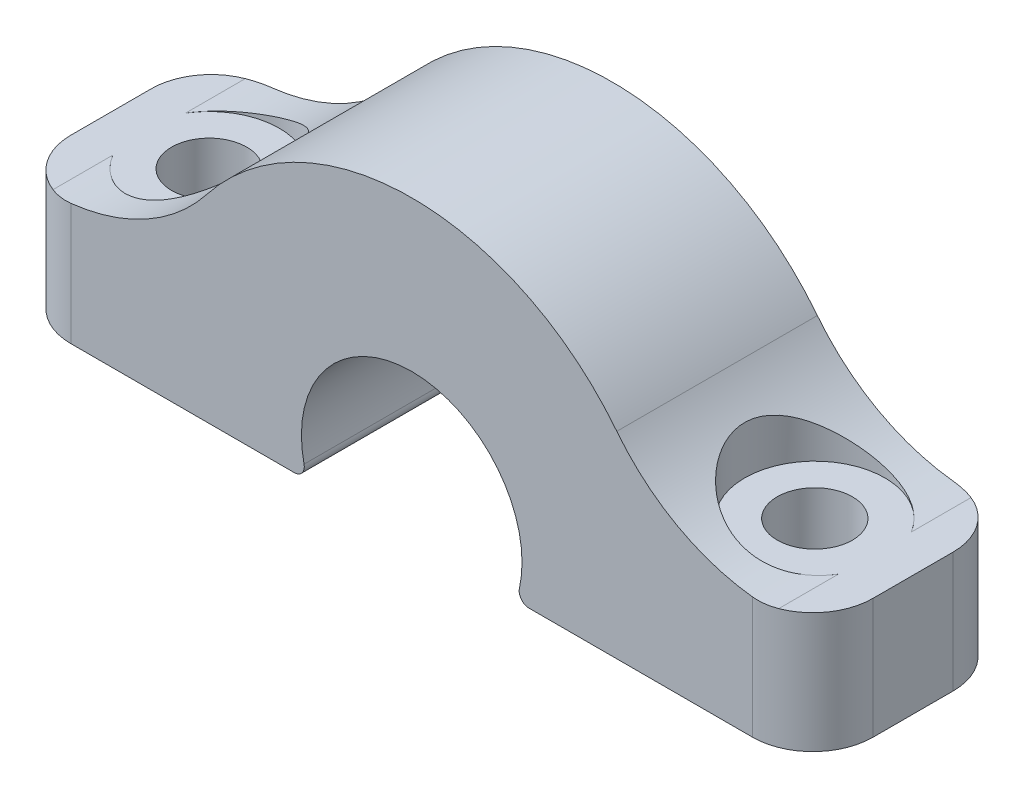
ISO-10303-21;
HEADER;
FILE_DESCRIPTION(('STEP AP214'),'2;1');
FILE_NAME('part.step','',(''),(''),'','','');
FILE_SCHEMA(('AUTOMOTIVE_DESIGN { 1 0 10303 214 1 1 1 1 }'));
ENDSEC;
DATA;
#1=APPLICATION_CONTEXT('core data for automotive mechanical design processes');
#2=APPLICATION_PROTOCOL_DEFINITION('international standard','automotive_design',2000,#1);
#3=PRODUCT_CONTEXT('',#1,'mechanical');
#4=PRODUCT('Part','Part','',(#3));
#5=PRODUCT_RELATED_PRODUCT_CATEGORY('part','',(#4));
#6=PRODUCT_DEFINITION_FORMATION('','',#4);
#7=PRODUCT_DEFINITION_CONTEXT('part definition',#1,'design');
#8=PRODUCT_DEFINITION('design','',#6,#7);
#9=PRODUCT_DEFINITION_SHAPE('','',#8);
#10=(LENGTH_UNIT() NAMED_UNIT(*) SI_UNIT(.MILLI.,.METRE.));
#11=(NAMED_UNIT(*) PLANE_ANGLE_UNIT() SI_UNIT($,.RADIAN.));
#12=(NAMED_UNIT(*) SI_UNIT($,.STERADIAN.) SOLID_ANGLE_UNIT());
#13=UNCERTAINTY_MEASURE_WITH_UNIT(LENGTH_MEASURE(1.E-05),#10,'distance_accuracy_value','');
#14=(GEOMETRIC_REPRESENTATION_CONTEXT(3) GLOBAL_UNCERTAINTY_ASSIGNED_CONTEXT((#13)) GLOBAL_UNIT_ASSIGNED_CONTEXT((#10,
#11,#12)) REPRESENTATION_CONTEXT('',''));
#15=CARTESIAN_POINT('',(0.,0.,0.));
#16=DIRECTION('',(0.,0.,1.));
#17=DIRECTION('',(1.,0.,0.));
#18=AXIS2_PLACEMENT_3D('',#15,#16,#17);
#19=CARTESIAN_POINT('',(18.0930926046378,17.,-5.));
#20=DIRECTION('',(0.,0.,1.));
#21=DIRECTION('',(1.,0.,0.));
#22=AXIS2_PLACEMENT_3D('',#19,#20,#21);
#23=CYLINDRICAL_SURFACE('',#22,10.);
#24=CARTESIAN_POINT('',(15.1,7.45843845798486,-3.5));
#25=CARTESIAN_POINT('',(14.9957744815553,7.49113363654862,-3.49999937894351));
#26=CARTESIAN_POINT('',(14.8920503182847,7.52555320507264,-3.49533712732048));
#27=CARTESIAN_POINT('',(14.6864704692407,7.59750925332968,-3.4770199790426));
#28=CARTESIAN_POINT('',(14.5846161602821,7.63504792553514,-3.46335870928451));
#29=CARTESIAN_POINT('',(14.2824899176906,7.75198358004934,-3.40932965524012));
#30=CARTESIAN_POINT('',(14.0860212484733,7.83558448011288,-3.35591892824392));
#31=CARTESIAN_POINT('',(13.7093247893162,8.00969664178313,-3.21809350096264));
#32=CARTESIAN_POINT('',(13.529012882222,8.10016695792562,-3.13385258982976));
#33=CARTESIAN_POINT('',(13.1863493665392,8.28439911478833,-2.93716871963753));
#34=CARTESIAN_POINT('',(13.02400023678,8.37816140744907,-2.82472187519056));
#35=CARTESIAN_POINT('',(12.7065629849136,8.57249224575692,-2.56271175755584));
#36=CARTESIAN_POINT('',(12.5533637698057,8.67293561779904,-2.41075656121847));
#37=CARTESIAN_POINT('',(12.2752726352632,8.86480192370938,-2.07794628512325));
#38=CARTESIAN_POINT('',(12.1503521796092,8.95623389792142,-1.89712065580072));
#39=CARTESIAN_POINT('',(11.9626391695541,9.09888545795057,-1.56001922457868));
#40=CARTESIAN_POINT('',(11.8921514642007,9.15434833718121,-1.40986803018752));
#41=CARTESIAN_POINT('',(11.802185773267,9.22658581403245,-1.17534780702147));
#42=CARTESIAN_POINT('',(11.7748256169936,9.24883817568156,-1.09562879811018));
#43=CARTESIAN_POINT('',(11.7257125784066,9.28913220849675,-0.933462509857196));
#44=CARTESIAN_POINT('',(11.7039571578905,9.30717578533317,-0.851016484648285));
#45=CARTESIAN_POINT('',(11.6662221241169,9.33867193699765,-0.683111797568064));
#46=CARTESIAN_POINT('',(11.6502980817797,9.35208027541501,-0.597632255087932));
#47=CARTESIAN_POINT('',(11.6248193687653,9.37361681617258,-0.42510997969888));
#48=CARTESIAN_POINT('',(11.6152614657036,9.38174769806889,-0.338068063171454));
#49=CARTESIAN_POINT('',(11.6027085577498,9.3924388625069,-0.163187769991199));
#50=CARTESIAN_POINT('',(11.5997116662892,9.39500074636982,-0.0753496295830434));
#51=CARTESIAN_POINT('',(11.6003326450853,9.39447182720633,0.100256545071428));
#52=CARTESIAN_POINT('',(11.6039498388818,9.39138160225339,0.188024585568789));
#53=CARTESIAN_POINT('',(11.6228314718648,9.37530143219923,0.427055087597409));
#54=CARTESIAN_POINT('',(11.6447101447259,9.35669817190197,0.57749253583343));
#55=CARTESIAN_POINT('',(11.7069447325321,9.30463072760712,0.871703498224611));
#56=CARTESIAN_POINT('',(11.7473083321797,9.27116036311155,1.01547421342967));
#57=CARTESIAN_POINT('',(11.8469541618087,9.19038766563389,1.30061826486027));
#58=CARTESIAN_POINT('',(11.9070679776435,9.14248688068783,1.44152729686208));
#59=CARTESIAN_POINT('',(12.0432555740981,9.03715631246864,1.71149416262173));
#60=CARTESIAN_POINT('',(12.1193362467417,8.97972241651586,1.84054684393924));
#61=CARTESIAN_POINT('',(12.3032809386475,8.84563905955013,2.11202692115639));
#62=CARTESIAN_POINT('',(12.4144634126502,8.76749968202169,2.25146977371429));
#63=CARTESIAN_POINT('',(12.6550416510483,8.60663424610772,2.51067488688945));
#64=CARTESIAN_POINT('',(12.7844535922079,8.52390415389179,2.63041946047944));
#65=CARTESIAN_POINT('',(13.085600845355,8.3419672382751,2.86982458403003));
#66=CARTESIAN_POINT('',(13.2607076911718,8.24261230718238,2.98515884804211));
#67=CARTESIAN_POINT('',(13.6308432677508,8.04835682973504,3.18364694361469));
#68=CARTESIAN_POINT('',(13.8258789010724,7.95345784347094,3.26678957716333));
#69=CARTESIAN_POINT('',(14.1323788401958,7.81709485270784,3.3653554471492));
#70=CARTESIAN_POINT('',(14.2381901877526,7.77215023832249,3.3940271875056));
#71=CARTESIAN_POINT('',(14.4531899577727,7.68525293462506,3.44147324397777));
#72=CARTESIAN_POINT('',(14.5623767863815,7.64329886324644,3.46025215800144));
#73=CARTESIAN_POINT('',(14.7832483134498,7.56290595365833,3.48741245178604));
#74=CARTESIAN_POINT('',(14.8949317308244,7.52446536185573,3.49579904493841));
#75=CARTESIAN_POINT('',(15.1198568836275,7.45150078429819,3.50175029356037));
#76=CARTESIAN_POINT('',(15.2330983884136,7.41697622570415,3.49931653393513));
#77=CARTESIAN_POINT('',(15.4478609074293,7.35563068656795,3.48415147405378));
#78=CARTESIAN_POINT('',(15.5493401578691,7.32838071121656,3.47254931625256));
#79=CARTESIAN_POINT('',(15.7517426466029,7.27739915762988,3.440309474335));
#80=CARTESIAN_POINT('',(15.8526659469785,7.25366717855236,3.41967282067446));
#81=CARTESIAN_POINT('',(16.0529765019127,7.20977852684445,3.36934653787664));
#82=CARTESIAN_POINT('',(16.152364383771,7.18962035686131,3.33966071440072));
#83=CARTESIAN_POINT('',(16.3486793023969,7.15281794401081,3.27132997948347));
#84=CARTESIAN_POINT('',(16.4456064874189,7.13617348900141,3.23268560921394));
#85=CARTESIAN_POINT('',(16.6274283587798,7.10760294226065,3.15055490896479));
#86=CARTESIAN_POINT('',(16.712618779908,7.09538636320077,3.10782188171888));
#87=CARTESIAN_POINT('',(16.8795081963375,7.07355562454869,3.01536965362439));
#88=CARTESIAN_POINT('',(16.9612059868913,7.06394235693911,2.96564806710039));
#89=CARTESIAN_POINT('',(17.1203892868874,7.04709836326033,2.85957451546335));
#90=CARTESIAN_POINT('',(17.1978766520727,7.03986658032266,2.80322550661329));
#91=CARTESIAN_POINT('',(17.3480835190137,7.02750534832115,2.68427212015379));
#92=CARTESIAN_POINT('',(17.4208012223994,7.02237668844176,2.62166540531743));
#93=CARTESIAN_POINT('',(17.6293755460405,7.00979529078277,2.42655071449442));
#94=CARTESIAN_POINT('',(17.7575585415072,7.00496242896702,2.28547539382554));
#95=CARTESIAN_POINT('',(17.9893198544501,6.99986291402521,1.98443562107609));
#96=CARTESIAN_POINT('',(18.0928954850621,6.99959675930955,1.82446910912931));
#97=CARTESIAN_POINT('',(18.2749535180071,7.00122815220176,1.48576633138951));
#98=CARTESIAN_POINT('',(18.352763276931,7.00317855900787,1.30666779298222));
#99=CARTESIAN_POINT('',(18.4775663297718,7.00719718131972,0.938043615602341));
#100=CARTESIAN_POINT('',(18.5245581793218,7.00926540234222,0.748517488362954));
#101=CARTESIAN_POINT('',(18.5867706238402,7.01214330937153,0.362130375357476));
#102=CARTESIAN_POINT('',(18.6016314455307,7.01293871824201,0.165211198451593));
#103=CARTESIAN_POINT('',(18.598084014714,7.01275888016385,-0.228325980345983));
#104=CARTESIAN_POINT('',(18.5796753460304,7.01178361106535,-0.424943978439362));
#105=CARTESIAN_POINT('',(18.5101524466422,7.00864106519968,-0.812098067565622));
#106=CARTESIAN_POINT('',(18.4590703749759,7.00647496081514,-1.00263994567654));
#107=CARTESIAN_POINT('',(18.3256711722529,7.00248378715893,-1.37247663176384));
#108=CARTESIAN_POINT('',(18.2433518683241,7.0006587416246,-1.55177065632454));
#109=CARTESIAN_POINT('',(18.0496799549429,6.99962666731385,-1.89423619976817));
#110=CARTESIAN_POINT('',(17.9382921165705,7.00042282894123,-2.05738782207028));
#111=CARTESIAN_POINT('',(17.6897654666638,7.00736634716127,-2.36258852160409));
#112=CARTESIAN_POINT('',(17.5526314364807,7.01351271093195,-2.50464150832536));
#113=CARTESIAN_POINT('',(17.2585214614946,7.03381102419551,-2.76197735117371));
#114=CARTESIAN_POINT('',(17.1017952225305,7.04786889727982,-2.87755273370649));
#115=CARTESIAN_POINT('',(16.772221742401,7.08623374057863,-3.08076912178361));
#116=CARTESIAN_POINT('',(16.5993711006876,7.11054287655103,-3.1684042175814));
#117=CARTESIAN_POINT('',(16.247642533179,7.17017847031685,-3.31182244509366));
#118=CARTESIAN_POINT('',(16.0690031027637,7.20523139675054,-3.36830843597894));
#119=CARTESIAN_POINT('',(15.7078039151829,7.28688854330758,-3.45178540085418));
#120=CARTESIAN_POINT('',(15.5252525587755,7.33346991070254,-3.4788341622518));
#121=CARTESIAN_POINT('',(15.3028527028846,7.39706412749919,-3.49435634530499));
#122=CARTESIAN_POINT('',(15.262199370282,7.40897058645229,-3.4964760057621));
#123=CARTESIAN_POINT('',(15.1810055148722,7.43331094294677,-3.49929781742354));
#124=CARTESIAN_POINT('',(15.1404649718761,7.44574473862698,-3.50000024112169));
#125=CARTESIAN_POINT('',(15.1,7.45843845798486,-3.5));
#126=B_SPLINE_CURVE_WITH_KNOTS('',3,(#24,#25,#26,#27,#28,#29,#30,#31,#32,#33,#34,#35,#36,#37,
#38,#39,#40,#41,#42,#43,#44,#45,#46,#47,#48,#49,#50,#51,#52,#53,#54,#55,#56,#57,#58,#59,#60,#61,
#62,#63,#64,#65,#66,#67,#68,#69,#70,#71,#72,#73,#74,#75,#76,#77,#78,#79,#80,#81,#82,#83,#84,#85,
#86,#87,#88,#89,#90,#91,#92,#93,#94,#95,#96,#97,#98,#99,#100,#101,#102,#103,#104,#105,#106,#107,
#108,#109,#110,#111,#112,#113,#114,#115,#116,#117,#118,#119,#120,#121,#122,#123,#124,#125),
.UNSPECIFIED.,.T.,.F.,(4,2,2,2,2,2,2,2,2,2,2,2,2,2,2,2,2,2,2,2,2,2,2,2,2,2,2,2,2,2,2,2,2,2,2,2,
2,2,2,2,2,2,2,2,2,2,2,2,2,2,4),(0.,0.327647525564086,0.655527340882722,1.31242469581866,
1.96567477529758,2.61901488990963,3.32971583839109,4.03969638639893,4.56221265415913,
4.82345032659621,5.08456948419244,5.34811596356358,5.61152852593489,5.87486533608785,
6.13817521478587,6.59533449581047,7.05268400353974,7.53248906853637,8.01250166682289,
8.59450693049691,9.17703195582964,9.87007743366992,10.5633637745515,10.9183965111297,
11.2732640925565,11.6279535796391,11.982591115488,12.2993007436538,12.6159742579856,
12.9325147774242,13.2490361801259,13.536949892438,13.8249621292735,14.1128463776502,
14.4008385542492,14.9700136367378,15.5392508385971,16.1223529512122,16.7054823905766,
17.2951080665974,17.8847411184444,18.4737947107853,19.062889285403,19.6527011417734,
20.2424035717435,20.8252376230724,21.4081948699864,21.9773951238533,22.5454759696809,
22.6727077457147,22.7999150564104),.UNSPECIFIED.);
#127=CARTESIAN_POINT('',(18.0930926046378,7.,-1.81422067567933));
#128=VERTEX_POINT('',#127);
#129=CARTESIAN_POINT('',(18.0930926046378,7.,1.81422067567933));
#130=VERTEX_POINT('',#129);
#131=EDGE_CURVE('E291',#128,#130,#126,.T.);
#132=ORIENTED_EDGE('',*,*,#131,.F.);
#133=DIRECTION('',(0.,0.,1.));
#134=VECTOR('',#133,1.);
#135=CARTESIAN_POINT('',(18.0930926046378,7.,0.));
#136=LINE('',#135,#134);
#137=CARTESIAN_POINT('',(18.0930926046378,7.,-4.79376959638517));
#138=VERTEX_POINT('',#137);
#139=EDGE_CURVE('E203',#138,#128,#136,.T.);
#140=ORIENTED_EDGE('',*,*,#139,.F.);
#141=CARTESIAN_POINT('',(17.,7.05992210504937,-5.));
#142=CARTESIAN_POINT('',(17.0932928171028,7.04964714715509,-5.00001761363657));
#143=CARTESIAN_POINT('',(17.186734605204,7.04071657795728,-4.99564815244513));
#144=CARTESIAN_POINT('',(17.3721472753903,7.02559620423717,-4.97826616698932));
#145=CARTESIAN_POINT('',(17.4641237443785,7.01938158089391,-4.96533474719992));
#146=CARTESIAN_POINT('',(17.6466128424469,7.00955409442707,-4.93095766707939));
#147=CARTESIAN_POINT('',(17.7371254720048,7.00594123045424,-4.90951200952746));
#148=CARTESIAN_POINT('',(17.9166770159635,7.00114575990753,-4.85806448174473));
#149=CARTESIAN_POINT('',(18.0056939905066,6.99998638714077,-4.82798384912236));
#150=CARTESIAN_POINT('',(18.0930926046378,7.,-4.79376959638517));
#151=B_SPLINE_CURVE_WITH_KNOTS('',3,(#141,#142,#143,#144,#145,#146,#147,#148,#149,#150),
.UNSPECIFIED.,.F.,.F.,(4,2,2,2,4),(0.,0.281460478359114,0.560292209620826,0.8391238498668,
1.12058433747897),.UNSPECIFIED.);
#152=CARTESIAN_POINT('',(17.,7.05992210504937,-5.));
#153=VERTEX_POINT('',#152);
#154=EDGE_CURVE('E213',#153,#138,#151,.T.);
#155=ORIENTED_EDGE('',*,*,#154,.F.);
#156=CARTESIAN_POINT('',(18.0930926046378,17.,-5.));
#157=DIRECTION('',(0.,0.,-1.));
#158=DIRECTION('',(-1.,0.,0.));
#159=AXIS2_PLACEMENT_3D('',#156,#157,#158);
#160=CIRCLE('',#159,10.);
#161=CARTESIAN_POINT('',(10.2265306026214,10.8260869565217,-5.));
#162=VERTEX_POINT('',#161);
#163=EDGE_CURVE('E210',#162,#153,#160,.F.);
#164=ORIENTED_EDGE('',*,*,#163,.F.);
#165=DIRECTION('',(0.,0.,1.));
#166=VECTOR('',#165,1.);
#167=CARTESIAN_POINT('',(10.2265306026214,10.8260869565217,-5.));
#168=LINE('',#167,#166);
#169=CARTESIAN_POINT('',(10.2265306026214,10.8260869565217,5.));
#170=VERTEX_POINT('',#169);
#171=EDGE_CURVE('E199',#170,#162,#168,.F.);
#172=ORIENTED_EDGE('',*,*,#171,.F.);
#173=CARTESIAN_POINT('',(18.0930926046378,17.,5.));
#174=DIRECTION('',(0.,0.,-1.));
#175=DIRECTION('',(-1.,0.,0.));
#176=AXIS2_PLACEMENT_3D('',#173,#174,#175);
#177=CIRCLE('',#176,10.);
#178=CARTESIAN_POINT('',(17.,7.05992210504937,5.));
#179=VERTEX_POINT('',#178);
#180=EDGE_CURVE('E258',#179,#170,#177,.T.);
#181=ORIENTED_EDGE('',*,*,#180,.F.);
#182=CARTESIAN_POINT('',(18.0930926046378,7.,4.79376959638516));
#183=CARTESIAN_POINT('',(18.0056939905066,6.99998638714077,4.82798384912236));
#184=CARTESIAN_POINT('',(17.9166770159635,7.00114575990753,4.85806448174473));
#185=CARTESIAN_POINT('',(17.7371254720048,7.00594123045424,4.90951200952746));
#186=CARTESIAN_POINT('',(17.6466128424469,7.00955409442707,4.93095766707939));
#187=CARTESIAN_POINT('',(17.4641237443785,7.01938158089391,4.96533474719992));
#188=CARTESIAN_POINT('',(17.3721472753903,7.02559620423717,4.97826616698932));
#189=CARTESIAN_POINT('',(17.186734605204,7.04071657795728,4.99564815244513));
#190=CARTESIAN_POINT('',(17.0932928171028,7.04964714715509,5.00001761363657));
#191=CARTESIAN_POINT('',(17.,7.05992210504937,5.));
#192=B_SPLINE_CURVE_WITH_KNOTS('',3,(#182,#183,#184,#185,#186,#187,#188,#189,#190,#191),
.UNSPECIFIED.,.F.,.F.,(4,2,2,2,4),(0.,0.281460487612172,0.560292127858149,0.839123859119861,
1.12058433747898),.UNSPECIFIED.);
#193=CARTESIAN_POINT('',(18.0930926046378,7.,4.79376959638517));
#194=VERTEX_POINT('',#193);
#195=EDGE_CURVE('E221',#194,#179,#192,.T.);
#196=ORIENTED_EDGE('',*,*,#195,.F.);
#197=EDGE_CURVE('E202',#130,#194,#136,.T.);
#198=ORIENTED_EDGE('',*,*,#197,.F.);
#199=EDGE_LOOP('',(#132,#140,#155,#164,#172,#181,#196,#198));
#200=FACE_BOUND('',#199,.T.);
#201=ADVANCED_FACE('F35',(#200),#23,.F.);
#202=CARTESIAN_POINT('',(-18.0930926046378,17.,-5.));
#203=DIRECTION('',(0.,0.,1.));
#204=DIRECTION('',(1.,0.,0.));
#205=AXIS2_PLACEMENT_3D('',#202,#203,#204);
#206=CYLINDRICAL_SURFACE('',#205,10.);
#207=CARTESIAN_POINT('',(-15.1,7.45843845798486,-3.5));
#208=CARTESIAN_POINT('',(-15.2834277997035,7.40090695716317,-3.49999066826392));
#209=CARTESIAN_POINT('',(-15.4687657610313,7.34862734222983,-3.48552038245482));
#210=CARTESIAN_POINT('',(-15.8378074749595,7.2557703915537,-3.42646166699087));
#211=CARTESIAN_POINT('',(-16.0215084197412,7.2152103985226,-3.3818289254521));
#212=CARTESIAN_POINT('',(-16.3814187232349,7.14587521165078,-3.26250038474906));
#213=CARTESIAN_POINT('',(-16.5576225463508,7.11710859476981,-3.18778278379244));
#214=CARTESIAN_POINT('',(-16.8964875585437,7.07037602678274,-3.00985930199252));
#215=CARTESIAN_POINT('',(-17.0591524764834,7.05240709326013,-2.9066612991931));
#216=CARTESIAN_POINT('',(-17.3629826722405,7.02554147166527,-2.67666983330573));
#217=CARTESIAN_POINT('',(-17.5044843154718,7.01648618615473,-2.55033815456611));
#218=CARTESIAN_POINT('',(-17.7653555426681,7.00451706121325,-2.27632982824353));
#219=CARTESIAN_POINT('',(-17.8847217423332,7.00160416018988,-2.1286499228507));
#220=CARTESIAN_POINT('',(-18.100182461238,6.99940856197634,-1.81278354770215));
#221=CARTESIAN_POINT('',(-18.1957606109973,7.00020005992698,-1.64424436111084));
#222=CARTESIAN_POINT('',(-18.3578438735667,7.00317514712742,-1.29373284350162));
#223=CARTESIAN_POINT('',(-18.4243469314023,7.00535883474784,-1.11175956404867));
#224=CARTESIAN_POINT('',(-18.5273703620938,7.0092974732317,-0.73602965190725));
#225=CARTESIAN_POINT('',(-18.5633397127392,7.01104415924604,-0.542121547914356));
#226=CARTESIAN_POINT('',(-18.6022589512753,7.01295150144977,-0.151012819944393));
#227=CARTESIAN_POINT('',(-18.6052086584278,7.01311214895771,0.0461878220489879));
#228=CARTESIAN_POINT('',(-18.5779981081284,7.01175460975479,0.438397843414499));
#229=CARTESIAN_POINT('',(-18.5478190871509,7.0102354716395,0.633405917728495));
#230=CARTESIAN_POINT('',(-18.4551792099365,7.00645107854674,1.01559807563222));
#231=CARTESIAN_POINT('',(-18.3927166288358,7.00418578370555,1.20278174059745));
#232=CARTESIAN_POINT('',(-18.2372117953768,7.00073752444821,1.56416973734807));
#233=CARTESIAN_POINT('',(-18.1441461774695,6.99955538964883,1.73836402663252));
#234=CARTESIAN_POINT('',(-17.9300860132855,7.00075794899764,2.06865530210253));
#235=CARTESIAN_POINT('',(-17.809092034601,7.00314257066352,2.22475265597787));
#236=CARTESIAN_POINT('',(-17.543413762564,7.01424049397875,2.51356825858127));
#237=CARTESIAN_POINT('',(-17.3988542951994,7.02292123858995,2.64640243062431));
#238=CARTESIAN_POINT('',(-17.0901127938524,7.04922261139505,2.88575459160649));
#239=CARTESIAN_POINT('',(-16.9259355258794,7.06684107159457,2.99227895312342));
#240=CARTESIAN_POINT('',(-16.5874329362918,7.1125618432032,3.17388762689993));
#241=CARTESIAN_POINT('',(-16.4134394940798,7.14040632560948,3.24965598838407));
#242=CARTESIAN_POINT('',(-16.05756825448,7.20768647783975,3.37171273794461));
#243=CARTESIAN_POINT('',(-15.8756911761125,7.24712109248398,3.41800380845516));
#244=CARTESIAN_POINT('',(-15.5110188968479,7.33729135521934,3.48067146910933));
#245=CARTESIAN_POINT('',(-15.3282385302708,7.3879477024821,3.49725089624894));
#246=CARTESIAN_POINT('',(-14.9655691581031,7.49975554466481,3.50212051393028));
#247=CARTESIAN_POINT('',(-14.7856808937561,7.5609096847011,3.49040356492023));
#248=CARTESIAN_POINT('',(-14.4229531255653,7.69572099479273,3.43904786405821));
#249=CARTESIAN_POINT('',(-14.2405264740658,7.76989107715806,3.39786077295345));
#250=CARTESIAN_POINT('',(-13.8872740346788,7.92539816146559,3.28839298346583));
#251=CARTESIAN_POINT('',(-13.7164519822913,8.00673745198733,3.2201036088519));
#252=CARTESIAN_POINT('',(-13.3711330477757,8.18270725918668,3.04992665228034));
#253=CARTESIAN_POINT('',(-13.1982950150058,8.27781612948347,2.9451716890558));
#254=CARTESIAN_POINT('',(-12.8729280364799,8.46855988742549,2.70754456164778));
#255=CARTESIAN_POINT('',(-12.7204287265338,8.56419533570941,2.57463208269867));
#256=CARTESIAN_POINT('',(-12.5040195730018,8.70719807406514,2.35006437885128));
#257=CARTESIAN_POINT('',(-12.4316733995088,8.7564969646185,2.267627043866));
#258=CARTESIAN_POINT('',(-12.2943889154492,8.85248161355721,2.09540014275785));
#259=CARTESIAN_POINT('',(-12.2294520793938,8.89916685086862,2.00560911928451));
#260=CARTESIAN_POINT('',(-12.0470215002274,9.03334085777505,1.72587670972019));
#261=CARTESIAN_POINT('',(-11.9413577751495,9.11532167183537,1.52501221287622));
#262=CARTESIAN_POINT('',(-11.7971366745349,9.23040782444195,1.16840182870995));
#263=CARTESIAN_POINT('',(-11.7479306309856,9.27073801020154,1.01921757674304));
#264=CARTESIAN_POINT('',(-11.6696269895597,9.33568704690166,0.712393120078947));
#265=CARTESIAN_POINT('',(-11.640503104172,9.36032643382656,0.554764261930327));
#266=CARTESIAN_POINT('',(-11.6041166787003,9.3912020110793,0.234340642887545));
#267=CARTESIAN_POINT('',(-11.5969662347835,9.39734383405572,0.0715236605855106));
#268=CARTESIAN_POINT('',(-11.6053891217753,9.39015596533031,-0.253098559892682));
#269=CARTESIAN_POINT('',(-11.6209653408876,9.37682379878845,-0.414903666850746));
#270=CARTESIAN_POINT('',(-11.67180870229,9.33396553587417,-0.721033199487878));
#271=CARTESIAN_POINT('',(-11.7056014521664,9.3056546133953,-0.865783640127171));
#272=CARTESIAN_POINT('',(-11.7900404823002,9.23633415032461,-1.14707079432378));
#273=CARTESIAN_POINT('',(-11.8406983109437,9.19531590971949,-1.28360180376034));
#274=CARTESIAN_POINT('',(-11.9790169468286,9.08618620313541,-1.59649103124284));
#275=CARTESIAN_POINT('',(-12.0734255715497,9.0136976447259,-1.76834285062752));
#276=CARTESIAN_POINT('',(-12.2863718616278,8.85755311119165,-2.09067700572786));
#277=CARTESIAN_POINT('',(-12.4049425792095,8.77388189343306,-2.24112958473544));
#278=CARTESIAN_POINT('',(-12.6646861026554,8.60016923888973,-2.52114889442843));
#279=CARTESIAN_POINT('',(-12.8061384329732,8.51005790209813,-2.65041136969594));
#280=CARTESIAN_POINT('',(-13.1081130759026,8.32930755240912,-2.88423946321176));
#281=CARTESIAN_POINT('',(-13.2686460515168,8.23866827163647,-2.98879117367663));
#282=CARTESIAN_POINT('',(-13.5331533158226,8.0995089517918,-3.13159061343375));
#283=CARTESIAN_POINT('',(-13.6316250532883,8.04969855570389,-3.17897664523509));
#284=CARTESIAN_POINT('',(-13.8333474107225,7.95195573500183,-3.26459568578308));
#285=CARTESIAN_POINT('',(-13.9365961483129,7.90402258417772,-3.30283226382807));
#286=CARTESIAN_POINT('',(-14.1470290711494,7.81077789132081,-3.36957043992309));
#287=CARTESIAN_POINT('',(-14.2542036729777,7.76546058093925,-3.39809419516396));
#288=CARTESIAN_POINT('',(-14.4719273140697,7.6779343679275,-3.44498333970176));
#289=CARTESIAN_POINT('',(-14.5824738676013,7.63572325023782,-3.46335602989238));
#290=CARTESIAN_POINT('',(-14.7611272004293,7.57115781620597,-3.48420668078943));
#291=CARTESIAN_POINT('',(-14.8284306225929,7.54764236354219,-3.49010520755279));
#292=CARTESIAN_POINT('',(-14.963734408962,7.50198808931567,-3.49800402479585));
#293=CARTESIAN_POINT('',(-15.031734920576,7.47984956622102,-3.50000347292889));
#294=CARTESIAN_POINT('',(-15.1,7.45843845798486,-3.5));
#295=B_SPLINE_CURVE_WITH_KNOTS('',3,(#207,#208,#209,#210,#211,#212,#213,#214,#215,#216,#217,
#218,#219,#220,#221,#222,#223,#224,#225,#226,#227,#228,#229,#230,#231,#232,#233,#234,#235,#236,
#237,#238,#239,#240,#241,#242,#243,#244,#245,#246,#247,#248,#249,#250,#251,#252,#253,#254,#255,
#256,#257,#258,#259,#260,#261,#262,#263,#264,#265,#266,#267,#268,#269,#270,#271,#272,#273,#274,
#275,#276,#277,#278,#279,#280,#281,#282,#283,#284,#285,#286,#287,#288,#289,#290,#291,#292,#293,
#294),.UNSPECIFIED.,.T.,.F.,(4,2,2,2,2,2,2,2,2,2,2,2,2,2,2,2,2,2,2,2,2,2,2,2,2,2,2,2,2,2,2,2,2,
2,2,2,2,2,2,2,2,2,2,4),(0.,0.576464149267561,1.15377703259595,1.7315090361744,2.30908139158132,
2.87618071669761,3.44336667458066,4.02196082008426,4.60059585295621,5.18946367026048,
5.77833471082466,6.36753944969245,6.95677567217015,7.54646282765702,8.13613799990167,
8.72278552536998,9.30929081753234,9.88192362601549,10.4545043174506,11.0231609753901,
11.5919611279521,12.1930730339056,12.7943775287275,13.461756913554,14.1300983615884,
14.4904101307437,14.8507934799123,15.5689814754956,16.0536838263592,16.5377504920165,
17.0242825288912,17.5108764017717,17.962970607612,18.4153750245102,19.0391657893871,
19.6638156591041,20.2967698601422,20.9300794584431,21.2899798397109,21.6497395903096,
22.008673059849,22.367348038507,22.5818404556497,22.7963792060377),.UNSPECIFIED.);
#296=CARTESIAN_POINT('',(-18.0930926046378,7.,1.81422067567933));
#297=VERTEX_POINT('',#296);
#298=CARTESIAN_POINT('',(-18.0930926046378,7.,-1.81422067567933));
#299=VERTEX_POINT('',#298);
#300=EDGE_CURVE('E276',#297,#299,#295,.T.);
#301=ORIENTED_EDGE('',*,*,#300,.F.);
#302=DIRECTION('',(0.,0.,-1.));
#303=VECTOR('',#302,1.);
#304=CARTESIAN_POINT('',(-18.0930926046378,7.,-5.));
#305=LINE('',#304,#303);
#306=CARTESIAN_POINT('',(-18.0930926046378,7.,4.79376959638517));
#307=VERTEX_POINT('',#306);
#308=EDGE_CURVE('E207',#307,#297,#305,.T.);
#309=ORIENTED_EDGE('',*,*,#308,.F.);
#310=CARTESIAN_POINT('',(-17.,7.05992210504937,5.));
#311=CARTESIAN_POINT('',(-17.0932928171028,7.04964714715509,5.00001761363657));
#312=CARTESIAN_POINT('',(-17.186734605204,7.04071657795728,4.99564815244513));
#313=CARTESIAN_POINT('',(-17.3721472753903,7.02559620423717,4.97826616698932));
#314=CARTESIAN_POINT('',(-17.4641237443785,7.01938158089391,4.96533474719992));
#315=CARTESIAN_POINT('',(-17.6466128424469,7.00955409442707,4.93095766707939));
#316=CARTESIAN_POINT('',(-17.7371254720048,7.00594123045424,4.90951200952746));
#317=CARTESIAN_POINT('',(-17.9166770159635,7.00114575990753,4.85806448174473));
#318=CARTESIAN_POINT('',(-18.0056939905066,6.99998638714077,4.82798384912236));
#319=CARTESIAN_POINT('',(-18.0930926046378,7.,4.79376959638517));
#320=B_SPLINE_CURVE_WITH_KNOTS('',3,(#310,#311,#312,#313,#314,#315,#316,#317,#318,#319),
.UNSPECIFIED.,.F.,.F.,(4,2,2,2,4),(0.,0.281460478359114,0.560292209620826,0.8391238498668,
1.12058433747897),.UNSPECIFIED.);
#321=CARTESIAN_POINT('',(-17.,7.05992210504937,5.));
#322=VERTEX_POINT('',#321);
#323=EDGE_CURVE('E270',#322,#307,#320,.T.);
#324=ORIENTED_EDGE('',*,*,#323,.F.);
#325=CARTESIAN_POINT('',(-18.0930926046378,17.,5.));
#326=DIRECTION('',(0.,0.,-1.));
#327=DIRECTION('',(-1.,0.,0.));
#328=AXIS2_PLACEMENT_3D('',#325,#326,#327);
#329=CIRCLE('',#328,10.);
#330=CARTESIAN_POINT('',(-10.2265306026214,10.8260869565217,5.));
#331=VERTEX_POINT('',#330);
#332=EDGE_CURVE('E277',#331,#322,#329,.T.);
#333=ORIENTED_EDGE('',*,*,#332,.F.);
#334=DIRECTION('',(0.,0.,1.));
#335=VECTOR('',#334,1.);
#336=CARTESIAN_POINT('',(-10.2265306026214,10.8260869565217,-5.));
#337=LINE('',#336,#335);
#338=CARTESIAN_POINT('',(-10.2265306026214,10.8260869565217,-5.));
#339=VERTEX_POINT('',#338);
#340=EDGE_CURVE('E197',#339,#331,#337,.T.);
#341=ORIENTED_EDGE('',*,*,#340,.F.);
#342=CARTESIAN_POINT('',(-18.0930926046378,17.,-5.));
#343=DIRECTION('',(0.,0.,-1.));
#344=DIRECTION('',(-1.,0.,0.));
#345=AXIS2_PLACEMENT_3D('',#342,#343,#344);
#346=CIRCLE('',#345,10.);
#347=CARTESIAN_POINT('',(-17.,7.05992210504937,-5.));
#348=VERTEX_POINT('',#347);
#349=EDGE_CURVE('E257',#348,#339,#346,.F.);
#350=ORIENTED_EDGE('',*,*,#349,.F.);
#351=CARTESIAN_POINT('',(-18.0930926046378,7.,-4.79376959638516));
#352=CARTESIAN_POINT('',(-18.0056939905066,6.99998638714077,-4.82798384912236));
#353=CARTESIAN_POINT('',(-17.9166770159635,7.00114575990753,-4.85806448174473));
#354=CARTESIAN_POINT('',(-17.7371254720048,7.00594123045424,-4.90951200952746));
#355=CARTESIAN_POINT('',(-17.6466128424469,7.00955409442707,-4.93095766707939));
#356=CARTESIAN_POINT('',(-17.4641237443785,7.01938158089391,-4.96533474719992));
#357=CARTESIAN_POINT('',(-17.3721472753903,7.02559620423717,-4.97826616698932));
#358=CARTESIAN_POINT('',(-17.186734605204,7.04071657795728,-4.99564815244513));
#359=CARTESIAN_POINT('',(-17.0932928171028,7.04964714715509,-5.00001761363657));
#360=CARTESIAN_POINT('',(-17.,7.05992210504937,-5.));
#361=B_SPLINE_CURVE_WITH_KNOTS('',3,(#351,#352,#353,#354,#355,#356,#357,#358,#359,#360),
.UNSPECIFIED.,.F.,.F.,(4,2,2,2,4),(0.,0.281460487612172,0.560292127858149,0.839123859119861,
1.12058433747898),.UNSPECIFIED.);
#362=CARTESIAN_POINT('',(-18.0930926046378,7.,-4.79376959638517));
#363=VERTEX_POINT('',#362);
#364=EDGE_CURVE('E250',#363,#348,#361,.T.);
#365=ORIENTED_EDGE('',*,*,#364,.F.);
#366=EDGE_CURVE('E206',#299,#363,#305,.T.);
#367=ORIENTED_EDGE('',*,*,#366,.F.);
#368=EDGE_LOOP('',(#301,#309,#324,#333,#341,#350,#365,#367));
#369=FACE_BOUND('',#368,.T.);
#370=ADVANCED_FACE('F260',(#369),#206,.F.);
#371=CARTESIAN_POINT('',(-15.1,-6.,0.));
#372=DIRECTION('',(0.,1.,0.));
#373=DIRECTION('',(0.,0.,1.));
#374=AXIS2_PLACEMENT_3D('',#371,#372,#373);
#375=CYLINDRICAL_SURFACE('',#374,1.875);
#376=CARTESIAN_POINT('',(-15.1,1.,0.));
#377=DIRECTION('',(0.,1.,0.));
#378=DIRECTION('',(0.,0.,1.));
#379=AXIS2_PLACEMENT_3D('',#376,#377,#378);
#380=CIRCLE('',#379,1.875);
#381=CARTESIAN_POINT('',(-15.1,1.,1.875));
#382=VERTEX_POINT('',#381);
#383=EDGE_CURVE('E390',#382,#382,#380,.F.);
#384=ORIENTED_EDGE('',*,*,#383,.T.);
#385=EDGE_LOOP('',(#384));
#386=FACE_BOUND('',#385,.T.);
#387=CARTESIAN_POINT('',(-15.1,7.,0.));
#388=DIRECTION('',(0.,1.,0.));
#389=DIRECTION('',(0.,0.,1.));
#390=AXIS2_PLACEMENT_3D('',#387,#388,#389);
#391=CIRCLE('',#390,1.875);
#392=CARTESIAN_POINT('',(-15.1,7.,1.875));
#393=VERTEX_POINT('',#392);
#394=EDGE_CURVE('E281',#393,#393,#391,.F.);
#395=ORIENTED_EDGE('',*,*,#394,.F.);
#396=EDGE_LOOP('',(#395));
#397=FACE_BOUND('',#396,.T.);
#398=ADVANCED_FACE('F263',(#386,#397),#375,.F.);
#399=CARTESIAN_POINT('',(0.,2.8,-5.));
#400=DIRECTION('',(0.,0.,1.));
#401=DIRECTION('',(1.,0.,0.));
#402=AXIS2_PLACEMENT_3D('',#399,#400,#401);
#403=CYLINDRICAL_SURFACE('',#402,13.);
#404=CARTESIAN_POINT('',(0.,2.8,5.));
#405=DIRECTION('',(0.,0.,1.));
#406=DIRECTION('',(-1.,0.,0.));
#407=AXIS2_PLACEMENT_3D('',#404,#405,#406);
#408=CIRCLE('',#407,13.);
#409=EDGE_CURVE('E380',#170,#331,#408,.T.);
#410=ORIENTED_EDGE('',*,*,#409,.F.);
#411=ORIENTED_EDGE('',*,*,#171,.T.);
#412=CARTESIAN_POINT('',(0.,2.8,-5.));
#413=DIRECTION('',(0.,0.,1.));
#414=DIRECTION('',(-1.,0.,0.));
#415=AXIS2_PLACEMENT_3D('',#412,#413,#414);
#416=CIRCLE('',#415,13.);
#417=EDGE_CURVE('E375',#162,#339,#416,.T.);
#418=ORIENTED_EDGE('',*,*,#417,.T.);
#419=ORIENTED_EDGE('',*,*,#340,.T.);
#420=EDGE_LOOP('',(#410,#411,#418,#419));
#421=FACE_BOUND('',#420,.T.);
#422=ADVANCED_FACE('F311',(#421),#403,.T.);
#423=CARTESIAN_POINT('',(0.,2.8,-5.));
#424=DIRECTION('',(0.,0.,1.));
#425=DIRECTION('',(1.,0.,0.));
#426=AXIS2_PLACEMENT_3D('',#423,#424,#425);
#427=CYLINDRICAL_SURFACE('',#426,5.5);
#428=CARTESIAN_POINT('',(0.,2.8,5.));
#429=DIRECTION('',(0.,0.,-1.));
#430=DIRECTION('',(-1.,0.,0.));
#431=AXIS2_PLACEMENT_3D('',#428,#429,#430);
#432=CIRCLE('',#431,5.5);
#433=CARTESIAN_POINT('',(-5.36935103672274,1.60833333333333,5.));
#434=VERTEX_POINT('',#433);
#435=CARTESIAN_POINT('',(5.36935103672274,1.60833333333333,5.));
#436=VERTEX_POINT('',#435);
#437=EDGE_CURVE('E383',#434,#436,#432,.T.);
#438=ORIENTED_EDGE('',*,*,#437,.F.);
#439=DIRECTION('',(0.,0.,1.));
#440=VECTOR('',#439,1.);
#441=CARTESIAN_POINT('',(-5.36935103672274,1.60833333333333,-5.));
#442=LINE('',#441,#440);
#443=CARTESIAN_POINT('',(-5.36935103672274,1.60833333333333,-5.));
#444=VERTEX_POINT('',#443);
#445=EDGE_CURVE('E445',#434,#444,#442,.F.);
#446=ORIENTED_EDGE('',*,*,#445,.T.);
#447=CARTESIAN_POINT('',(0.,2.8,-5.));
#448=DIRECTION('',(0.,0.,-1.));
#449=DIRECTION('',(-1.,0.,0.));
#450=AXIS2_PLACEMENT_3D('',#447,#448,#449);
#451=CIRCLE('',#450,5.5);
#452=CARTESIAN_POINT('',(5.36935103672274,1.60833333333333,-5.));
#453=VERTEX_POINT('',#452);
#454=EDGE_CURVE('E378',#444,#453,#451,.T.);
#455=ORIENTED_EDGE('',*,*,#454,.T.);
#456=DIRECTION('',(0.,0.,1.));
#457=VECTOR('',#456,1.);
#458=CARTESIAN_POINT('',(5.36935103672274,1.60833333333333,-5.));
#459=LINE('',#458,#457);
#460=EDGE_CURVE('E443',#453,#436,#459,.T.);
#461=ORIENTED_EDGE('',*,*,#460,.T.);
#462=EDGE_LOOP('',(#438,#446,#455,#461));
#463=FACE_BOUND('',#462,.T.);
#464=ADVANCED_FACE('F238',(#463),#427,.F.);
#465=CARTESIAN_POINT('',(0.,2.8,-5.));
#466=DIRECTION('',(0.,0.,-1.));
#467=DIRECTION('',(-1.,0.,0.));
#468=AXIS2_PLACEMENT_3D('',#465,#466,#467);
#469=PLANE('',#468);
#470=ORIENTED_EDGE('',*,*,#454,.F.);
#471=CARTESIAN_POINT('',(-5.85747385824299,1.5,-5.));
#472=DIRECTION('',(0.,0.,-1.));
#473=DIRECTION('',(-1.,0.,0.));
#474=AXIS2_PLACEMENT_3D('',#471,#472,#473);
#475=CIRCLE('',#474,0.5);
#476=CARTESIAN_POINT('',(-5.85747385824299,1.,-5.));
#477=VERTEX_POINT('',#476);
#478=EDGE_CURVE('E43',#444,#477,#475,.T.);
#479=ORIENTED_EDGE('',*,*,#478,.T.);
#480=DIRECTION('',(1.,0.,0.));
#481=VECTOR('',#480,1.);
#482=CARTESIAN_POINT('',(0.,1.,-5.));
#483=LINE('',#482,#481);
#484=CARTESIAN_POINT('',(-17.,1.,-5.));
#485=VERTEX_POINT('',#484);
#486=EDGE_CURVE('E404',#485,#477,#483,.T.);
#487=ORIENTED_EDGE('',*,*,#486,.F.);
#488=DIRECTION('',(0.,-1.,0.));
#489=VECTOR('',#488,1.);
#490=CARTESIAN_POINT('',(-17.,7.,-5.));
#491=LINE('',#490,#489);
#492=EDGE_CURVE('E373',#485,#348,#491,.F.);
#493=ORIENTED_EDGE('',*,*,#492,.T.);
#494=ORIENTED_EDGE('',*,*,#349,.T.);
#495=ORIENTED_EDGE('',*,*,#417,.F.);
#496=ORIENTED_EDGE('',*,*,#163,.T.);
#497=DIRECTION('',(0.,-1.,0.));
#498=VECTOR('',#497,1.);
#499=CARTESIAN_POINT('',(17.,0.,-5.));
#500=LINE('',#499,#498);
#501=CARTESIAN_POINT('',(17.,1.,-5.));
#502=VERTEX_POINT('',#501);
#503=EDGE_CURVE('E370',#153,#502,#500,.T.);
#504=ORIENTED_EDGE('',*,*,#503,.T.);
#505=CARTESIAN_POINT('',(5.85747385824299,1.,-5.));
#506=VERTEX_POINT('',#505);
#507=EDGE_CURVE('E394',#506,#502,#483,.T.);
#508=ORIENTED_EDGE('',*,*,#507,.F.);
#509=CARTESIAN_POINT('',(5.85747385824299,1.5,-5.));
#510=DIRECTION('',(0.,0.,-1.));
#511=DIRECTION('',(-1.,0.,0.));
#512=AXIS2_PLACEMENT_3D('',#509,#510,#511);
#513=CIRCLE('',#512,0.5);
#514=EDGE_CURVE('E50',#506,#453,#513,.T.);
#515=ORIENTED_EDGE('',*,*,#514,.T.);
#516=EDGE_LOOP('',(#470,#479,#487,#493,#494,#495,#496,#504,#508,#515));
#517=FACE_BOUND('',#516,.T.);
#518=ADVANCED_FACE('F332',(#517),#469,.T.);
#519=CARTESIAN_POINT('',(0.,2.8,5.));
#520=DIRECTION('',(0.,0.,-1.));
#521=DIRECTION('',(-1.,0.,0.));
#522=AXIS2_PLACEMENT_3D('',#519,#520,#521);
#523=PLANE('',#522);
#524=DIRECTION('',(1.,0.,0.));
#525=VECTOR('',#524,1.);
#526=CARTESIAN_POINT('',(0.,1.,5.));
#527=LINE('',#526,#525);
#528=CARTESIAN_POINT('',(-17.,1.,5.));
#529=VERTEX_POINT('',#528);
#530=CARTESIAN_POINT('',(-5.85747385824299,1.,5.));
#531=VERTEX_POINT('',#530);
#532=EDGE_CURVE('E168',#529,#531,#527,.T.);
#533=ORIENTED_EDGE('',*,*,#532,.T.);
#534=CARTESIAN_POINT('',(-5.85747385824299,1.5,5.));
#535=DIRECTION('',(0.,0.,-1.));
#536=DIRECTION('',(-1.,0.,0.));
#537=AXIS2_PLACEMENT_3D('',#534,#535,#536);
#538=CIRCLE('',#537,0.5);
#539=EDGE_CURVE('E438',#531,#434,#538,.F.);
#540=ORIENTED_EDGE('',*,*,#539,.T.);
#541=ORIENTED_EDGE('',*,*,#437,.T.);
#542=CARTESIAN_POINT('',(5.85747385824299,1.5,5.));
#543=DIRECTION('',(0.,0.,-1.));
#544=DIRECTION('',(-1.,0.,0.));
#545=AXIS2_PLACEMENT_3D('',#542,#543,#544);
#546=CIRCLE('',#545,0.5);
#547=CARTESIAN_POINT('',(5.85747385824299,1.,5.));
#548=VERTEX_POINT('',#547);
#549=EDGE_CURVE('E412',#436,#548,#546,.F.);
#550=ORIENTED_EDGE('',*,*,#549,.T.);
#551=CARTESIAN_POINT('',(17.,1.,5.));
#552=VERTEX_POINT('',#551);
#553=EDGE_CURVE('E397',#548,#552,#527,.T.);
#554=ORIENTED_EDGE('',*,*,#553,.T.);
#555=DIRECTION('',(0.,-1.,0.));
#556=VECTOR('',#555,1.);
#557=CARTESIAN_POINT('',(17.,2.8,5.));
#558=LINE('',#557,#556);
#559=EDGE_CURVE('E187',#552,#179,#558,.F.);
#560=ORIENTED_EDGE('',*,*,#559,.T.);
#561=ORIENTED_EDGE('',*,*,#180,.T.);
#562=ORIENTED_EDGE('',*,*,#409,.T.);
#563=ORIENTED_EDGE('',*,*,#332,.T.);
#564=DIRECTION('',(0.,-1.,0.));
#565=VECTOR('',#564,1.);
#566=CARTESIAN_POINT('',(-17.,2.8,5.));
#567=LINE('',#566,#565);
#568=EDGE_CURVE('E190',#322,#529,#567,.T.);
#569=ORIENTED_EDGE('',*,*,#568,.T.);
#570=EDGE_LOOP('',(#533,#540,#541,#550,#554,#560,#561,#562,#563,#569));
#571=FACE_BOUND('',#570,.T.);
#572=ADVANCED_FACE('F329',(#571),#523,.F.);
#573=CARTESIAN_POINT('',(-20.,7.,-5.));
#574=DIRECTION('',(1.,0.,0.));
#575=DIRECTION('',(0.,0.,-1.));
#576=AXIS2_PLACEMENT_3D('',#573,#574,#575);
#577=PLANE('',#576);
#578=DIRECTION('',(0.,-1.,0.));
#579=VECTOR('',#578,1.);
#580=CARTESIAN_POINT('',(-20.,0.,-2.));
#581=LINE('',#580,#579);
#582=CARTESIAN_POINT('',(-20.,7.,-2.));
#583=VERTEX_POINT('',#582);
#584=CARTESIAN_POINT('',(-20.,1.,-2.));
#585=VERTEX_POINT('',#584);
#586=EDGE_CURVE('E181',#583,#585,#581,.T.);
#587=ORIENTED_EDGE('',*,*,#586,.T.);
#588=DIRECTION('',(0.,0.,1.));
#589=VECTOR('',#588,1.);
#590=CARTESIAN_POINT('',(-20.,1.,-5.));
#591=LINE('',#590,#589);
#592=CARTESIAN_POINT('',(-20.,1.,2.));
#593=VERTEX_POINT('',#592);
#594=EDGE_CURVE('E164',#585,#593,#591,.T.);
#595=ORIENTED_EDGE('',*,*,#594,.T.);
#596=DIRECTION('',(0.,-1.,0.));
#597=VECTOR('',#596,1.);
#598=CARTESIAN_POINT('',(-20.,7.,2.));
#599=LINE('',#598,#597);
#600=CARTESIAN_POINT('',(-20.,7.,2.));
#601=VERTEX_POINT('',#600);
#602=EDGE_CURVE('E178',#593,#601,#599,.F.);
#603=ORIENTED_EDGE('',*,*,#602,.T.);
#604=DIRECTION('',(0.,0.,1.));
#605=VECTOR('',#604,1.);
#606=CARTESIAN_POINT('',(-20.,7.,-5.));
#607=LINE('',#606,#605);
#608=EDGE_CURVE('E386',#583,#601,#607,.T.);
#609=ORIENTED_EDGE('',*,*,#608,.F.);
#610=EDGE_LOOP('',(#587,#595,#603,#609));
#611=FACE_BOUND('',#610,.T.);
#612=ADVANCED_FACE('F176',(#611),#577,.F.);
#613=CARTESIAN_POINT('',(0.,7.,0.));
#614=DIRECTION('',(0.,1.,0.));
#615=DIRECTION('',(0.,0.,1.));
#616=AXIS2_PLACEMENT_3D('',#613,#614,#615);
#617=PLANE('',#616);
#618=ORIENTED_EDGE('',*,*,#308,.T.);
#619=CARTESIAN_POINT('',(-15.1,7.,0.));
#620=DIRECTION('',(0.,1.,0.));
#621=DIRECTION('',(0.,0.,1.));
#622=AXIS2_PLACEMENT_3D('',#619,#620,#621);
#623=CIRCLE('',#622,3.5);
#624=EDGE_CURVE('E282',#297,#299,#623,.T.);
#625=ORIENTED_EDGE('',*,*,#624,.T.);
#626=ORIENTED_EDGE('',*,*,#366,.T.);
#627=CARTESIAN_POINT('',(-17.,7.,-2.));
#628=DIRECTION('',(0.,1.,0.));
#629=DIRECTION('',(0.,0.,1.));
#630=AXIS2_PLACEMENT_3D('',#627,#628,#629);
#631=CIRCLE('',#630,3.);
#632=EDGE_CURVE('E195',#363,#583,#631,.T.);
#633=ORIENTED_EDGE('',*,*,#632,.T.);
#634=ORIENTED_EDGE('',*,*,#608,.T.);
#635=CARTESIAN_POINT('',(-17.,7.,2.));
#636=DIRECTION('',(0.,1.,0.));
#637=DIRECTION('',(0.,0.,1.));
#638=AXIS2_PLACEMENT_3D('',#635,#636,#637);
#639=CIRCLE('',#638,3.);
#640=EDGE_CURVE('E186',#601,#307,#639,.T.);
#641=ORIENTED_EDGE('',*,*,#640,.T.);
#642=EDGE_LOOP('',(#618,#625,#626,#633,#634,#641));
#643=FACE_BOUND('',#642,.T.);
#644=ORIENTED_EDGE('',*,*,#394,.T.);
#645=EDGE_LOOP('',(#644));
#646=FACE_BOUND('',#645,.T.);
#647=ADVANCED_FACE('F322',(#643,#646),#617,.T.);
#648=CARTESIAN_POINT('',(20.,7.,-5.));
#649=DIRECTION('',(-1.,0.,0.));
#650=DIRECTION('',(0.,0.,1.));
#651=AXIS2_PLACEMENT_3D('',#648,#649,#650);
#652=PLANE('',#651);
#653=DIRECTION('',(0.,-1.,0.));
#654=VECTOR('',#653,1.);
#655=CARTESIAN_POINT('',(20.,7.,2.));
#656=LINE('',#655,#654);
#657=CARTESIAN_POINT('',(20.,7.,2.));
#658=VERTEX_POINT('',#657);
#659=CARTESIAN_POINT('',(20.,1.,2.));
#660=VERTEX_POINT('',#659);
#661=EDGE_CURVE('E367',#658,#660,#656,.T.);
#662=ORIENTED_EDGE('',*,*,#661,.T.);
#663=DIRECTION('',(0.,0.,-1.));
#664=VECTOR('',#663,1.);
#665=CARTESIAN_POINT('',(20.,1.,-5.));
#666=LINE('',#665,#664);
#667=CARTESIAN_POINT('',(20.,1.,-2.));
#668=VERTEX_POINT('',#667);
#669=EDGE_CURVE('E398',#660,#668,#666,.T.);
#670=ORIENTED_EDGE('',*,*,#669,.T.);
#671=DIRECTION('',(0.,-1.,0.));
#672=VECTOR('',#671,1.);
#673=CARTESIAN_POINT('',(20.,7.,-2.));
#674=LINE('',#673,#672);
#675=CARTESIAN_POINT('',(20.,7.,-2.));
#676=VERTEX_POINT('',#675);
#677=EDGE_CURVE('E363',#668,#676,#674,.F.);
#678=ORIENTED_EDGE('',*,*,#677,.T.);
#679=DIRECTION('',(0.,0.,-1.));
#680=VECTOR('',#679,1.);
#681=CARTESIAN_POINT('',(20.,7.,-5.));
#682=LINE('',#681,#680);
#683=EDGE_CURVE('E284',#658,#676,#682,.T.);
#684=ORIENTED_EDGE('',*,*,#683,.F.);
#685=EDGE_LOOP('',(#662,#670,#678,#684));
#686=FACE_BOUND('',#685,.T.);
#687=ADVANCED_FACE('F318',(#686),#652,.F.);
#688=CARTESIAN_POINT('',(0.,7.,0.));
#689=DIRECTION('',(0.,-1.,0.));
#690=DIRECTION('',(0.,0.,-1.));
#691=AXIS2_PLACEMENT_3D('',#688,#689,#690);
#692=PLANE('',#691);
#693=ORIENTED_EDGE('',*,*,#139,.T.);
#694=CARTESIAN_POINT('',(15.1,7.,0.));
#695=DIRECTION('',(0.,1.,0.));
#696=DIRECTION('',(0.,0.,-1.));
#697=AXIS2_PLACEMENT_3D('',#694,#695,#696);
#698=CIRCLE('',#697,3.5);
#699=EDGE_CURVE('E355',#128,#130,#698,.T.);
#700=ORIENTED_EDGE('',*,*,#699,.T.);
#701=ORIENTED_EDGE('',*,*,#197,.T.);
#702=CARTESIAN_POINT('',(17.,7.,2.));
#703=DIRECTION('',(0.,-1.,0.));
#704=DIRECTION('',(0.,0.,-1.));
#705=AXIS2_PLACEMENT_3D('',#702,#703,#704);
#706=CIRCLE('',#705,3.);
#707=EDGE_CURVE('E361',#194,#658,#706,.F.);
#708=ORIENTED_EDGE('',*,*,#707,.T.);
#709=ORIENTED_EDGE('',*,*,#683,.T.);
#710=CARTESIAN_POINT('',(17.,7.,-2.));
#711=DIRECTION('',(0.,-1.,0.));
#712=DIRECTION('',(0.,0.,-1.));
#713=AXIS2_PLACEMENT_3D('',#710,#711,#712);
#714=CIRCLE('',#713,3.);
#715=EDGE_CURVE('E358',#676,#138,#714,.F.);
#716=ORIENTED_EDGE('',*,*,#715,.T.);
#717=EDGE_LOOP('',(#693,#700,#701,#708,#709,#716));
#718=FACE_BOUND('',#717,.T.);
#719=CARTESIAN_POINT('',(15.1,7.,0.));
#720=DIRECTION('',(0.,-1.,0.));
#721=DIRECTION('',(0.,0.,-1.));
#722=AXIS2_PLACEMENT_3D('',#719,#720,#721);
#723=CIRCLE('',#722,1.875);
#724=CARTESIAN_POINT('',(15.1,7.,-1.875));
#725=VERTEX_POINT('',#724);
#726=EDGE_CURVE('E278',#725,#725,#723,.F.);
#727=ORIENTED_EDGE('',*,*,#726,.F.);
#728=EDGE_LOOP('',(#727));
#729=FACE_BOUND('',#728,.T.);
#730=ADVANCED_FACE('F236',(#718,#729),#692,.F.);
#731=CARTESIAN_POINT('',(17.,2.8,-2.));
#732=DIRECTION('',(0.,1.,0.));
#733=DIRECTION('',(0.,0.,1.));
#734=AXIS2_PLACEMENT_3D('',#731,#732,#733);
#735=CYLINDRICAL_SURFACE('',#734,3.);
#736=CARTESIAN_POINT('',(17.,1.,-2.));
#737=DIRECTION('',(0.,1.,0.));
#738=DIRECTION('',(0.,0.,1.));
#739=AXIS2_PLACEMENT_3D('',#736,#737,#738);
#740=CIRCLE('',#739,3.);
#741=EDGE_CURVE('E395',#502,#668,#740,.F.);
#742=ORIENTED_EDGE('',*,*,#741,.F.);
#743=ORIENTED_EDGE('',*,*,#503,.F.);
#744=ORIENTED_EDGE('',*,*,#154,.T.);
#745=ORIENTED_EDGE('',*,*,#715,.F.);
#746=ORIENTED_EDGE('',*,*,#677,.F.);
#747=EDGE_LOOP('',(#742,#743,#744,#745,#746));
#748=FACE_BOUND('',#747,.T.);
#749=ADVANCED_FACE('F231',(#748),#735,.T.);
#750=CARTESIAN_POINT('',(17.,7.,2.));
#751=DIRECTION('',(0.,-1.,0.));
#752=DIRECTION('',(0.,0.,-1.));
#753=AXIS2_PLACEMENT_3D('',#750,#751,#752);
#754=CYLINDRICAL_SURFACE('',#753,3.);
#755=CARTESIAN_POINT('',(17.,1.,2.));
#756=DIRECTION('',(0.,1.,0.));
#757=DIRECTION('',(0.,0.,1.));
#758=AXIS2_PLACEMENT_3D('',#755,#756,#757);
#759=CIRCLE('',#758,3.);
#760=EDGE_CURVE('E401',#660,#552,#759,.F.);
#761=ORIENTED_EDGE('',*,*,#760,.F.);
#762=ORIENTED_EDGE('',*,*,#661,.F.);
#763=ORIENTED_EDGE('',*,*,#707,.F.);
#764=ORIENTED_EDGE('',*,*,#195,.T.);
#765=ORIENTED_EDGE('',*,*,#559,.F.);
#766=EDGE_LOOP('',(#761,#762,#763,#764,#765));
#767=FACE_BOUND('',#766,.T.);
#768=ADVANCED_FACE('F235',(#767),#754,.T.);
#769=CARTESIAN_POINT('',(-17.,7.,-2.));
#770=DIRECTION('',(0.,1.,0.));
#771=DIRECTION('',(0.,0.,1.));
#772=AXIS2_PLACEMENT_3D('',#769,#770,#771);
#773=CYLINDRICAL_SURFACE('',#772,3.);
#774=CARTESIAN_POINT('',(-17.,1.,-2.));
#775=DIRECTION('',(0.,1.,0.));
#776=DIRECTION('',(0.,0.,1.));
#777=AXIS2_PLACEMENT_3D('',#774,#775,#776);
#778=CIRCLE('',#777,3.);
#779=EDGE_CURVE('E406',#585,#485,#778,.F.);
#780=ORIENTED_EDGE('',*,*,#779,.F.);
#781=ORIENTED_EDGE('',*,*,#586,.F.);
#782=ORIENTED_EDGE('',*,*,#632,.F.);
#783=ORIENTED_EDGE('',*,*,#364,.T.);
#784=ORIENTED_EDGE('',*,*,#492,.F.);
#785=EDGE_LOOP('',(#780,#781,#782,#783,#784));
#786=FACE_BOUND('',#785,.T.);
#787=ADVANCED_FACE('F243',(#786),#773,.T.);
#788=CARTESIAN_POINT('',(-17.,2.8,2.));
#789=DIRECTION('',(0.,-1.,0.));
#790=DIRECTION('',(0.,0.,-1.));
#791=AXIS2_PLACEMENT_3D('',#788,#789,#790);
#792=CYLINDRICAL_SURFACE('',#791,3.);
#793=CARTESIAN_POINT('',(-17.,1.,2.));
#794=DIRECTION('',(0.,1.,0.));
#795=DIRECTION('',(0.,0.,1.));
#796=AXIS2_PLACEMENT_3D('',#793,#794,#795);
#797=CIRCLE('',#796,3.);
#798=EDGE_CURVE('E159',#529,#593,#797,.F.);
#799=ORIENTED_EDGE('',*,*,#798,.F.);
#800=ORIENTED_EDGE('',*,*,#568,.F.);
#801=ORIENTED_EDGE('',*,*,#323,.T.);
#802=ORIENTED_EDGE('',*,*,#640,.F.);
#803=ORIENTED_EDGE('',*,*,#602,.F.);
#804=EDGE_LOOP('',(#799,#800,#801,#802,#803));
#805=FACE_BOUND('',#804,.T.);
#806=ADVANCED_FACE('F184',(#805),#792,.T.);
#807=CARTESIAN_POINT('',(15.1,-6.,0.));
#808=DIRECTION('',(0.,1.,0.));
#809=DIRECTION('',(0.,0.,1.));
#810=AXIS2_PLACEMENT_3D('',#807,#808,#809);
#811=CYLINDRICAL_SURFACE('',#810,1.875);
#812=CARTESIAN_POINT('',(15.1,1.,0.));
#813=DIRECTION('',(0.,1.,0.));
#814=DIRECTION('',(0.,0.,1.));
#815=AXIS2_PLACEMENT_3D('',#812,#813,#814);
#816=CIRCLE('',#815,1.875);
#817=CARTESIAN_POINT('',(15.1,1.,1.875));
#818=VERTEX_POINT('',#817);
#819=EDGE_CURVE('E172',#818,#818,#816,.F.);
#820=ORIENTED_EDGE('',*,*,#819,.T.);
#821=EDGE_LOOP('',(#820));
#822=FACE_BOUND('',#821,.T.);
#823=ORIENTED_EDGE('',*,*,#726,.T.);
#824=EDGE_LOOP('',(#823));
#825=FACE_BOUND('',#824,.T.);
#826=ADVANCED_FACE('F307',(#822,#825),#811,.F.);
#827=CARTESIAN_POINT('',(15.1,17.,0.));
#828=DIRECTION('',(0.,-1.,0.));
#829=DIRECTION('',(0.,0.,-1.));
#830=AXIS2_PLACEMENT_3D('',#827,#828,#829);
#831=CYLINDRICAL_SURFACE('',#830,3.5);
#832=ORIENTED_EDGE('',*,*,#131,.T.);
#833=ORIENTED_EDGE('',*,*,#699,.F.);
#834=EDGE_LOOP('',(#832,#833));
#835=FACE_BOUND('',#834,.T.);
#836=ADVANCED_FACE('F302',(#835),#831,.F.);
#837=CARTESIAN_POINT('',(-15.1,17.,0.));
#838=DIRECTION('',(0.,-1.,0.));
#839=DIRECTION('',(0.,0.,-1.));
#840=AXIS2_PLACEMENT_3D('',#837,#838,#839);
#841=CYLINDRICAL_SURFACE('',#840,3.5);
#842=ORIENTED_EDGE('',*,*,#300,.T.);
#843=ORIENTED_EDGE('',*,*,#624,.F.);
#844=EDGE_LOOP('',(#842,#843));
#845=FACE_BOUND('',#844,.T.);
#846=ADVANCED_FACE('F297',(#845),#841,.F.);
#847=CARTESIAN_POINT('',(0.,1.,0.));
#848=DIRECTION('',(0.,1.,0.));
#849=DIRECTION('',(0.,0.,1.));
#850=AXIS2_PLACEMENT_3D('',#847,#848,#849);
#851=PLANE('',#850);
#852=ORIENTED_EDGE('',*,*,#553,.F.);
#853=DIRECTION('',(0.,0.,-1.));
#854=VECTOR('',#853,1.);
#855=CARTESIAN_POINT('',(5.85747385824299,1.,-5.));
#856=LINE('',#855,#854);
#857=EDGE_CURVE('E11',#548,#506,#856,.T.);
#858=ORIENTED_EDGE('',*,*,#857,.T.);
#859=ORIENTED_EDGE('',*,*,#507,.T.);
#860=ORIENTED_EDGE('',*,*,#741,.T.);
#861=ORIENTED_EDGE('',*,*,#669,.F.);
#862=ORIENTED_EDGE('',*,*,#760,.T.);
#863=EDGE_LOOP('',(#852,#858,#859,#860,#861,#862));
#864=FACE_BOUND('',#863,.T.);
#865=ORIENTED_EDGE('',*,*,#819,.F.);
#866=EDGE_LOOP('',(#865));
#867=FACE_BOUND('',#866,.T.);
#868=ADVANCED_FACE('F301',(#864,#867),#851,.F.);
#869=ORIENTED_EDGE('',*,*,#486,.T.);
#870=DIRECTION('',(0.,0.,-1.));
#871=VECTOR('',#870,1.);
#872=CARTESIAN_POINT('',(-5.85747385824299,1.,5.));
#873=LINE('',#872,#871);
#874=EDGE_CURVE('E352',#477,#531,#873,.F.);
#875=ORIENTED_EDGE('',*,*,#874,.T.);
#876=ORIENTED_EDGE('',*,*,#532,.F.);
#877=ORIENTED_EDGE('',*,*,#798,.T.);
#878=ORIENTED_EDGE('',*,*,#594,.F.);
#879=ORIENTED_EDGE('',*,*,#779,.T.);
#880=EDGE_LOOP('',(#869,#875,#876,#877,#878,#879));
#881=FACE_BOUND('',#880,.T.);
#882=ORIENTED_EDGE('',*,*,#383,.F.);
#883=EDGE_LOOP('',(#882));
#884=FACE_BOUND('',#883,.T.);
#885=ADVANCED_FACE('F162',(#881,#884),#851,.F.);
#886=CARTESIAN_POINT('',(-5.85747385824299,1.5,-5.));
#887=DIRECTION('',(0.,0.,1.));
#888=DIRECTION('',(1.,0.,0.));
#889=AXIS2_PLACEMENT_3D('',#886,#887,#888);
#890=CYLINDRICAL_SURFACE('',#889,0.5);
#891=ORIENTED_EDGE('',*,*,#478,.F.);
#892=ORIENTED_EDGE('',*,*,#445,.F.);
#893=ORIENTED_EDGE('',*,*,#539,.F.);
#894=ORIENTED_EDGE('',*,*,#874,.F.);
#895=EDGE_LOOP('',(#891,#892,#893,#894));
#896=FACE_BOUND('',#895,.T.);
#897=ADVANCED_FACE('F265',(#896),#890,.T.);
#898=CARTESIAN_POINT('',(5.85747385824299,1.5,-5.));
#899=DIRECTION('',(0.,0.,1.));
#900=DIRECTION('',(1.,0.,0.));
#901=AXIS2_PLACEMENT_3D('',#898,#899,#900);
#902=CYLINDRICAL_SURFACE('',#901,0.5);
#903=ORIENTED_EDGE('',*,*,#549,.F.);
#904=ORIENTED_EDGE('',*,*,#460,.F.);
#905=ORIENTED_EDGE('',*,*,#514,.F.);
#906=ORIENTED_EDGE('',*,*,#857,.F.);
#907=EDGE_LOOP('',(#903,#904,#905,#906));
#908=FACE_BOUND('',#907,.T.);
#909=ADVANCED_FACE('F37',(#908),#902,.T.);
#910=CLOSED_SHELL('',(#201,#370,#398,#422,#464,#518,#572,#612,#647,#687,#730,#749,#768,#787,
#806,#826,#836,#846,#868,#885,#897,#909));
#911=MANIFOLD_SOLID_BREP('B2',#910);
#912=ADVANCED_BREP_SHAPE_REPRESENTATION('',(#18,#911),#14);
#913=SHAPE_DEFINITION_REPRESENTATION(#9,#912);
ENDSEC;
END-ISO-10303-21;
